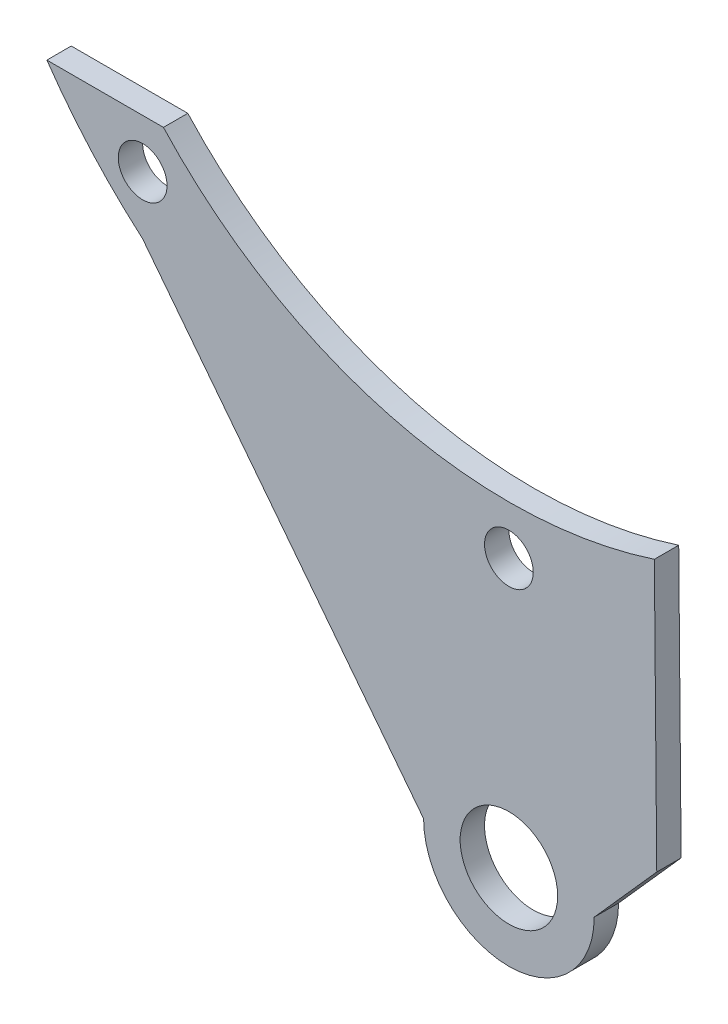
ISO-10303-21;
HEADER;
FILE_DESCRIPTION(('STEP AP214'),'2;1');
FILE_NAME('part.step','',(''),(''),'','','');
FILE_SCHEMA(('AUTOMOTIVE_DESIGN { 1 0 10303 214 1 1 1 1 }'));
ENDSEC;
DATA;
#1=APPLICATION_CONTEXT('core data for automotive mechanical design processes');
#2=APPLICATION_PROTOCOL_DEFINITION('international standard','automotive_design',2000,#1);
#3=PRODUCT_CONTEXT('',#1,'mechanical');
#4=PRODUCT('Part','Part','',(#3));
#5=PRODUCT_RELATED_PRODUCT_CATEGORY('part','',(#4));
#6=PRODUCT_DEFINITION_FORMATION('','',#4);
#7=PRODUCT_DEFINITION_CONTEXT('part definition',#1,'design');
#8=PRODUCT_DEFINITION('design','',#6,#7);
#9=PRODUCT_DEFINITION_SHAPE('','',#8);
#10=(LENGTH_UNIT() NAMED_UNIT(*) SI_UNIT(.MILLI.,.METRE.));
#11=(NAMED_UNIT(*) PLANE_ANGLE_UNIT() SI_UNIT($,.RADIAN.));
#12=(NAMED_UNIT(*) SI_UNIT($,.STERADIAN.) SOLID_ANGLE_UNIT());
#13=UNCERTAINTY_MEASURE_WITH_UNIT(LENGTH_MEASURE(1.E-05),#10,'distance_accuracy_value','');
#14=(GEOMETRIC_REPRESENTATION_CONTEXT(3) GLOBAL_UNCERTAINTY_ASSIGNED_CONTEXT((#13)) GLOBAL_UNIT_ASSIGNED_CONTEXT((#10,
#11,#12)) REPRESENTATION_CONTEXT('',''));
#15=CARTESIAN_POINT('',(0.,0.,0.));
#16=DIRECTION('',(0.,0.,1.));
#17=DIRECTION('',(1.,0.,0.));
#18=AXIS2_PLACEMENT_3D('',#15,#16,#17);
#19=CARTESIAN_POINT('',(-35.0306901055866,-27.2136707671394,2.));
#20=DIRECTION('',(-0.789706285312124,-0.613485112238697,0.));
#21=DIRECTION('',(0.613485112238697,-0.789706285312124,0.));
#22=AXIS2_PLACEMENT_3D('',#19,#20,#21);
#23=PLANE('',#22);
#24=DIRECTION('',(-0.613485112238697,0.789706285312124,0.));
#25=VECTOR('',#24,1.);
#26=CARTESIAN_POINT('',(-35.0306901055866,-27.2136707671394,0.));
#27=LINE('',#26,#25);
#28=CARTESIAN_POINT('',(-6.74095238095239,-63.6295238095238,0.));
#29=VERTEX_POINT('',#28);
#30=CARTESIAN_POINT('',(-29.7929905813807,-33.9558787723964,0.));
#31=VERTEX_POINT('',#30);
#32=EDGE_CURVE('E157',#29,#31,#27,.T.);
#33=ORIENTED_EDGE('',*,*,#32,.F.);
#34=DIRECTION('',(0.,0.,-1.));
#35=VECTOR('',#34,1.);
#36=CARTESIAN_POINT('',(-6.74095238095239,-63.6295238095238,2.));
#37=LINE('',#36,#35);
#38=CARTESIAN_POINT('',(-6.74095238095239,-63.6295238095238,2.));
#39=VERTEX_POINT('',#38);
#40=EDGE_CURVE('E11',#39,#29,#37,.T.);
#41=ORIENTED_EDGE('',*,*,#40,.F.);
#42=DIRECTION('',(-0.613485112238697,0.789706285312124,0.));
#43=VECTOR('',#42,1.);
#44=CARTESIAN_POINT('',(-35.0306901055866,-27.2136707671394,2.));
#45=LINE('',#44,#43);
#46=CARTESIAN_POINT('',(-29.7929905813807,-33.9558787723964,2.));
#47=VERTEX_POINT('',#46);
#48=EDGE_CURVE('E241',#39,#47,#45,.T.);
#49=ORIENTED_EDGE('',*,*,#48,.T.);
#50=DIRECTION('',(0.,0.,-1.));
#51=VECTOR('',#50,1.);
#52=CARTESIAN_POINT('',(-29.7929905813807,-33.9558787723964,2.));
#53=LINE('',#52,#51);
#54=EDGE_CURVE('E90',#47,#31,#53,.T.);
#55=ORIENTED_EDGE('',*,*,#54,.T.);
#56=EDGE_LOOP('',(#33,#41,#49,#55));
#57=FACE_BOUND('',#56,.T.);
#58=ADVANCED_FACE('F41',(#57),#23,.T.);
#59=CARTESIAN_POINT('',(0.259047619047606,-63.6295238095238,2.));
#60=DIRECTION('',(0.,0.,-1.));
#61=DIRECTION('',(-1.,0.,0.));
#62=AXIS2_PLACEMENT_3D('',#59,#60,#61);
#63=CYLINDRICAL_SURFACE('',#62,7.);
#64=CARTESIAN_POINT('',(0.259047619047606,-63.6295238095238,0.));
#65=DIRECTION('',(0.,0.,1.));
#66=DIRECTION('',(1.,0.,0.));
#67=AXIS2_PLACEMENT_3D('',#64,#65,#66);
#68=CIRCLE('',#67,7.);
#69=CARTESIAN_POINT('',(7.2590476190476,-63.6295238095238,0.));
#70=VERTEX_POINT('',#69);
#71=EDGE_CURVE('E154',#29,#70,#68,.T.);
#72=ORIENTED_EDGE('',*,*,#71,.T.);
#73=DIRECTION('',(0.,0.,-1.));
#74=VECTOR('',#73,1.);
#75=CARTESIAN_POINT('',(7.2590476190476,-63.6295238095238,2.));
#76=LINE('',#75,#74);
#77=CARTESIAN_POINT('',(7.2590476190476,-63.6295238095238,2.));
#78=VERTEX_POINT('',#77);
#79=EDGE_CURVE('E51',#78,#70,#76,.T.);
#80=ORIENTED_EDGE('',*,*,#79,.F.);
#81=CARTESIAN_POINT('',(0.259047619047606,-63.6295238095238,2.));
#82=DIRECTION('',(0.,0.,1.));
#83=DIRECTION('',(1.,0.,0.));
#84=AXIS2_PLACEMENT_3D('',#81,#82,#83);
#85=CIRCLE('',#84,7.);
#86=EDGE_CURVE('E245',#39,#78,#85,.T.);
#87=ORIENTED_EDGE('',*,*,#86,.F.);
#88=ORIENTED_EDGE('',*,*,#40,.T.);
#89=EDGE_LOOP('',(#72,#80,#87,#88));
#90=FACE_BOUND('',#89,.T.);
#91=ADVANCED_FACE('F155',(#90),#63,.T.);
#92=CARTESIAN_POINT('',(35.6504292146698,-31.6958704615058,2.));
#93=DIRECTION('',(-0.747340613310736,0.664441124326553,0.));
#94=DIRECTION('',(-0.664441124326553,-0.747340613310736,0.));
#95=AXIS2_PLACEMENT_3D('',#92,#93,#94);
#96=PLANE('',#95);
#97=DIRECTION('',(0.664441124326553,0.747340613310736,0.));
#98=VECTOR('',#97,1.);
#99=CARTESIAN_POINT('',(35.6504292146698,-31.6958704615058,0.));
#100=LINE('',#99,#98);
#101=CARTESIAN_POINT('',(12.3920044430049,-57.856149825784,0.));
#102=VERTEX_POINT('',#101);
#103=EDGE_CURVE('E148',#70,#102,#100,.T.);
#104=ORIENTED_EDGE('',*,*,#103,.T.);
#105=DIRECTION('',(0.,0.,-1.));
#106=VECTOR('',#105,1.);
#107=CARTESIAN_POINT('',(12.3920044430049,-57.856149825784,2.));
#108=LINE('',#107,#106);
#109=CARTESIAN_POINT('',(12.3920044430049,-57.856149825784,2.));
#110=VERTEX_POINT('',#109);
#111=EDGE_CURVE('E134',#110,#102,#108,.T.);
#112=ORIENTED_EDGE('',*,*,#111,.F.);
#113=DIRECTION('',(0.664441124326553,0.747340613310736,0.));
#114=VECTOR('',#113,1.);
#115=CARTESIAN_POINT('',(35.6504292146698,-31.6958704615058,2.));
#116=LINE('',#115,#114);
#117=EDGE_CURVE('E150',#78,#110,#116,.T.);
#118=ORIENTED_EDGE('',*,*,#117,.F.);
#119=ORIENTED_EDGE('',*,*,#79,.T.);
#120=EDGE_LOOP('',(#104,#112,#118,#119));
#121=FACE_BOUND('',#120,.T.);
#122=ADVANCED_FACE('F146',(#121),#96,.F.);
#123=CARTESIAN_POINT('',(11.873063689579,0.106300141213019,2.));
#124=DIRECTION('',(0.99995992385083,0.00895269189922725,0.));
#125=DIRECTION('',(-0.00895269189922725,0.99995992385083,0.));
#126=AXIS2_PLACEMENT_3D('',#123,#124,#125);
#127=PLANE('',#126);
#128=DIRECTION('',(0.00895269189922725,-0.99995992385083,0.));
#129=VECTOR('',#128,1.);
#130=CARTESIAN_POINT('',(11.873063689579,0.106300141213019,0.));
#131=LINE('',#130,#129);
#132=CARTESIAN_POINT('',(12.1939340292137,-35.7329182747429,0.));
#133=VERTEX_POINT('',#132);
#134=EDGE_CURVE('E161',#133,#102,#131,.T.);
#135=ORIENTED_EDGE('',*,*,#134,.F.);
#136=DIRECTION('',(0.,0.,-1.));
#137=VECTOR('',#136,1.);
#138=CARTESIAN_POINT('',(12.1939340292137,-35.7329182747429,2.));
#139=LINE('',#138,#137);
#140=CARTESIAN_POINT('',(12.1939340292137,-35.7329182747429,2.));
#141=VERTEX_POINT('',#140);
#142=EDGE_CURVE('E130',#141,#133,#139,.T.);
#143=ORIENTED_EDGE('',*,*,#142,.F.);
#144=DIRECTION('',(0.00895269189922725,-0.99995992385083,0.));
#145=VECTOR('',#144,1.);
#146=CARTESIAN_POINT('',(11.873063689579,0.106300141213019,2.));
#147=LINE('',#146,#145);
#148=EDGE_CURVE('E122',#141,#110,#147,.T.);
#149=ORIENTED_EDGE('',*,*,#148,.T.);
#150=ORIENTED_EDGE('',*,*,#111,.T.);
#151=EDGE_LOOP('',(#135,#143,#149,#150));
#152=FACE_BOUND('',#151,.T.);
#153=ADVANCED_FACE('F214',(#152),#127,.T.);
#154=CARTESIAN_POINT('',(0.259047619047657,0.870476190476369,2.));
#155=DIRECTION('',(0.,0.,-1.));
#156=DIRECTION('',(-1.,0.,0.));
#157=AXIS2_PLACEMENT_3D('',#154,#155,#156);
#158=CYLINDRICAL_SURFACE('',#157,38.5000000000001);
#159=CARTESIAN_POINT('',(0.259047619047657,0.870476190476369,0.));
#160=DIRECTION('',(0.,0.,1.));
#161=DIRECTION('',(1.,0.,0.));
#162=AXIS2_PLACEMENT_3D('',#159,#160,#161);
#163=CIRCLE('',#162,38.5000000000001);
#164=CARTESIAN_POINT('',(-28.0877565324511,-25.1815620099521,0.));
#165=VERTEX_POINT('',#164);
#166=EDGE_CURVE('E128',#133,#165,#163,.F.);
#167=ORIENTED_EDGE('',*,*,#166,.T.);
#168=DIRECTION('',(0.,0.,-1.));
#169=VECTOR('',#168,1.);
#170=CARTESIAN_POINT('',(-28.0877565324511,-25.1815620099521,2.));
#171=LINE('',#170,#169);
#172=CARTESIAN_POINT('',(-28.0877565324511,-25.1815620099521,2.));
#173=VERTEX_POINT('',#172);
#174=EDGE_CURVE('E112',#173,#165,#171,.T.);
#175=ORIENTED_EDGE('',*,*,#174,.F.);
#176=CARTESIAN_POINT('',(0.259047619047657,0.870476190476369,2.));
#177=DIRECTION('',(0.,0.,1.));
#178=DIRECTION('',(1.,0.,0.));
#179=AXIS2_PLACEMENT_3D('',#176,#177,#178);
#180=CIRCLE('',#179,38.5000000000001);
#181=EDGE_CURVE('E116',#141,#173,#180,.F.);
#182=ORIENTED_EDGE('',*,*,#181,.F.);
#183=ORIENTED_EDGE('',*,*,#142,.T.);
#184=EDGE_LOOP('',(#167,#175,#182,#183));
#185=FACE_BOUND('',#184,.T.);
#186=ADVANCED_FACE('F126',(#185),#158,.F.);
#187=CARTESIAN_POINT('',(0.,-25.1815620099521,2.));
#188=DIRECTION('',(0.,-1.,0.));
#189=DIRECTION('',(0.,0.,-1.));
#190=AXIS2_PLACEMENT_3D('',#187,#188,#189);
#191=PLANE('',#190);
#192=DIRECTION('',(-1.,0.,0.));
#193=VECTOR('',#192,1.);
#194=CARTESIAN_POINT('',(0.,-25.1815620099521,0.));
#195=LINE('',#194,#193);
#196=CARTESIAN_POINT('',(-37.6525773211132,-25.1815620099521,0.));
#197=VERTEX_POINT('',#196);
#198=EDGE_CURVE('E171',#165,#197,#195,.T.);
#199=ORIENTED_EDGE('',*,*,#198,.T.);
#200=DIRECTION('',(0.,0.,-1.));
#201=VECTOR('',#200,1.);
#202=CARTESIAN_POINT('',(-37.6525773211132,-25.1815620099521,2.));
#203=LINE('',#202,#201);
#204=CARTESIAN_POINT('',(-37.6525773211132,-25.1815620099521,2.));
#205=VERTEX_POINT('',#204);
#206=EDGE_CURVE('E114',#205,#197,#203,.T.);
#207=ORIENTED_EDGE('',*,*,#206,.F.);
#208=DIRECTION('',(-1.,0.,0.));
#209=VECTOR('',#208,1.);
#210=CARTESIAN_POINT('',(0.,-25.1815620099521,2.));
#211=LINE('',#210,#209);
#212=EDGE_CURVE('E107',#173,#205,#211,.T.);
#213=ORIENTED_EDGE('',*,*,#212,.F.);
#214=ORIENTED_EDGE('',*,*,#174,.T.);
#215=EDGE_LOOP('',(#199,#207,#213,#214));
#216=FACE_BOUND('',#215,.T.);
#217=ADVANCED_FACE('F110',(#216),#191,.F.);
#218=CARTESIAN_POINT('',(0.259047619047606,-63.6295238095238,2.));
#219=DIRECTION('',(0.,0.,-1.));
#220=DIRECTION('',(-1.,0.,0.));
#221=AXIS2_PLACEMENT_3D('',#218,#219,#220);
#222=CYLINDRICAL_SURFACE('',#221,4.);
#223=CARTESIAN_POINT('',(0.259047619047606,-63.6295238095238,2.));
#224=DIRECTION('',(0.,0.,1.));
#225=DIRECTION('',(1.,0.,0.));
#226=AXIS2_PLACEMENT_3D('',#223,#224,#225);
#227=CIRCLE('',#226,4.);
#228=CARTESIAN_POINT('',(4.25904761904761,-63.6295238095238,2.));
#229=VERTEX_POINT('',#228);
#230=EDGE_CURVE('E239',#229,#229,#227,.T.);
#231=ORIENTED_EDGE('',*,*,#230,.T.);
#232=EDGE_LOOP('',(#231));
#233=FACE_BOUND('',#232,.T.);
#234=CARTESIAN_POINT('',(0.259047619047606,-63.6295238095238,0.));
#235=DIRECTION('',(0.,0.,1.));
#236=DIRECTION('',(1.,0.,0.));
#237=AXIS2_PLACEMENT_3D('',#234,#235,#236);
#238=CIRCLE('',#237,4.);
#239=CARTESIAN_POINT('',(4.25904761904761,-63.6295238095238,0.));
#240=VERTEX_POINT('',#239);
#241=EDGE_CURVE('E163',#240,#240,#238,.T.);
#242=ORIENTED_EDGE('',*,*,#241,.F.);
#243=EDGE_LOOP('',(#242));
#244=FACE_BOUND('',#243,.T.);
#245=ADVANCED_FACE('F193',(#233,#244),#222,.F.);
#246=CARTESIAN_POINT('',(-29.7929905813807,-29.1815620099521,2.));
#247=DIRECTION('',(0.,0.,-1.));
#248=DIRECTION('',(-1.,0.,0.));
#249=AXIS2_PLACEMENT_3D('',#246,#247,#248);
#250=CYLINDRICAL_SURFACE('',#249,2.);
#251=CARTESIAN_POINT('',(-29.7929905813807,-29.1815620099521,2.));
#252=DIRECTION('',(0.,0.,1.));
#253=DIRECTION('',(1.,0.,0.));
#254=AXIS2_PLACEMENT_3D('',#251,#252,#253);
#255=CIRCLE('',#254,2.);
#256=CARTESIAN_POINT('',(-27.7929905813807,-29.1815620099521,2.));
#257=VERTEX_POINT('',#256);
#258=EDGE_CURVE('E237',#257,#257,#255,.T.);
#259=ORIENTED_EDGE('',*,*,#258,.T.);
#260=EDGE_LOOP('',(#259));
#261=FACE_BOUND('',#260,.T.);
#262=CARTESIAN_POINT('',(-29.7929905813807,-29.1815620099521,0.));
#263=DIRECTION('',(0.,0.,1.));
#264=DIRECTION('',(1.,0.,0.));
#265=AXIS2_PLACEMENT_3D('',#262,#263,#264);
#266=CIRCLE('',#265,2.);
#267=CARTESIAN_POINT('',(-27.7929905813807,-29.1815620099521,0.));
#268=VERTEX_POINT('',#267);
#269=EDGE_CURVE('E184',#268,#268,#266,.T.);
#270=ORIENTED_EDGE('',*,*,#269,.F.);
#271=EDGE_LOOP('',(#270));
#272=FACE_BOUND('',#271,.T.);
#273=ADVANCED_FACE('F195',(#261,#272),#250,.F.);
#274=CARTESIAN_POINT('',(0.259047619047603,-41.6295238095238,2.));
#275=DIRECTION('',(0.,0.,-1.));
#276=DIRECTION('',(-1.,0.,0.));
#277=AXIS2_PLACEMENT_3D('',#274,#275,#276);
#278=CYLINDRICAL_SURFACE('',#277,2.);
#279=CARTESIAN_POINT('',(0.259047619047603,-41.6295238095238,2.));
#280=DIRECTION('',(0.,0.,1.));
#281=DIRECTION('',(1.,0.,0.));
#282=AXIS2_PLACEMENT_3D('',#279,#280,#281);
#283=CIRCLE('',#282,2.);
#284=CARTESIAN_POINT('',(2.2590476190476,-41.6295238095238,2.));
#285=VERTEX_POINT('',#284);
#286=EDGE_CURVE('E175',#285,#285,#283,.T.);
#287=ORIENTED_EDGE('',*,*,#286,.T.);
#288=EDGE_LOOP('',(#287));
#289=FACE_BOUND('',#288,.T.);
#290=CARTESIAN_POINT('',(0.259047619047603,-41.6295238095238,0.));
#291=DIRECTION('',(0.,0.,1.));
#292=DIRECTION('',(1.,0.,0.));
#293=AXIS2_PLACEMENT_3D('',#290,#291,#292);
#294=CIRCLE('',#293,2.);
#295=CARTESIAN_POINT('',(2.2590476190476,-41.6295238095238,0.));
#296=VERTEX_POINT('',#295);
#297=EDGE_CURVE('E180',#296,#296,#294,.T.);
#298=ORIENTED_EDGE('',*,*,#297,.F.);
#299=EDGE_LOOP('',(#298));
#300=FACE_BOUND('',#299,.T.);
#301=ADVANCED_FACE('F43',(#289,#300),#278,.F.);
#302=CARTESIAN_POINT('',(0.259047619047985,0.870476190476536,2.));
#303=DIRECTION('',(0.,0.,-1.));
#304=DIRECTION('',(-1.,0.,0.));
#305=AXIS2_PLACEMENT_3D('',#302,#303,#304);
#306=CYLINDRICAL_SURFACE('',#305,46.0000000000005);
#307=CARTESIAN_POINT('',(0.259047619047985,0.870476190476536,0.));
#308=DIRECTION('',(0.,0.,1.));
#309=DIRECTION('',(1.,0.,0.));
#310=AXIS2_PLACEMENT_3D('',#307,#308,#309);
#311=CIRCLE('',#310,46.0000000000005);
#312=EDGE_CURVE('E83',#197,#31,#311,.T.);
#313=ORIENTED_EDGE('',*,*,#312,.T.);
#314=ORIENTED_EDGE('',*,*,#54,.F.);
#315=CARTESIAN_POINT('',(0.259047619047985,0.870476190476536,2.));
#316=DIRECTION('',(0.,0.,1.));
#317=DIRECTION('',(1.,0.,0.));
#318=AXIS2_PLACEMENT_3D('',#315,#316,#317);
#319=CIRCLE('',#318,46.0000000000005);
#320=EDGE_CURVE('E59',#205,#47,#319,.T.);
#321=ORIENTED_EDGE('',*,*,#320,.F.);
#322=ORIENTED_EDGE('',*,*,#206,.T.);
#323=EDGE_LOOP('',(#313,#314,#321,#322));
#324=FACE_BOUND('',#323,.T.);
#325=ADVANCED_FACE('F220',(#324),#306,.T.);
#326=CARTESIAN_POINT('',(0.,0.,2.));
#327=DIRECTION('',(0.,0.,1.));
#328=DIRECTION('',(1.,0.,0.));
#329=AXIS2_PLACEMENT_3D('',#326,#327,#328);
#330=PLANE('',#329);
#331=ORIENTED_EDGE('',*,*,#286,.F.);
#332=EDGE_LOOP('',(#331));
#333=FACE_BOUND('',#332,.T.);
#334=ORIENTED_EDGE('',*,*,#258,.F.);
#335=EDGE_LOOP('',(#334));
#336=FACE_BOUND('',#335,.T.);
#337=ORIENTED_EDGE('',*,*,#230,.F.);
#338=EDGE_LOOP('',(#337));
#339=FACE_BOUND('',#338,.T.);
#340=ORIENTED_EDGE('',*,*,#48,.F.);
#341=ORIENTED_EDGE('',*,*,#86,.T.);
#342=ORIENTED_EDGE('',*,*,#117,.T.);
#343=ORIENTED_EDGE('',*,*,#148,.F.);
#344=ORIENTED_EDGE('',*,*,#181,.T.);
#345=ORIENTED_EDGE('',*,*,#212,.T.);
#346=ORIENTED_EDGE('',*,*,#320,.T.);
#347=EDGE_LOOP('',(#340,#341,#342,#343,#344,#345,#346));
#348=FACE_BOUND('',#347,.T.);
#349=ADVANCED_FACE('F120',(#333,#336,#339,#348),#330,.T.);
#350=CARTESIAN_POINT('',(0.,0.,0.));
#351=DIRECTION('',(0.,0.,1.));
#352=DIRECTION('',(1.,0.,0.));
#353=AXIS2_PLACEMENT_3D('',#350,#351,#352);
#354=PLANE('',#353);
#355=ORIENTED_EDGE('',*,*,#297,.T.);
#356=EDGE_LOOP('',(#355));
#357=FACE_BOUND('',#356,.T.);
#358=ORIENTED_EDGE('',*,*,#269,.T.);
#359=EDGE_LOOP('',(#358));
#360=FACE_BOUND('',#359,.T.);
#361=ORIENTED_EDGE('',*,*,#241,.T.);
#362=EDGE_LOOP('',(#361));
#363=FACE_BOUND('',#362,.T.);
#364=ORIENTED_EDGE('',*,*,#32,.T.);
#365=ORIENTED_EDGE('',*,*,#312,.F.);
#366=ORIENTED_EDGE('',*,*,#198,.F.);
#367=ORIENTED_EDGE('',*,*,#166,.F.);
#368=ORIENTED_EDGE('',*,*,#134,.T.);
#369=ORIENTED_EDGE('',*,*,#103,.F.);
#370=ORIENTED_EDGE('',*,*,#71,.F.);
#371=EDGE_LOOP('',(#364,#365,#366,#367,#368,#369,#370));
#372=FACE_BOUND('',#371,.T.);
#373=ADVANCED_FACE('F191',(#357,#360,#363,#372),#354,.F.);
#374=CLOSED_SHELL('',(#58,#91,#122,#153,#186,#217,#245,#273,#301,#325,#349,#373));
#375=MANIFOLD_SOLID_BREP('B2',#374);
#376=ADVANCED_BREP_SHAPE_REPRESENTATION('',(#18,#375),#14);
#377=SHAPE_DEFINITION_REPRESENTATION(#9,#376);
ENDSEC;
END-ISO-10303-21;
